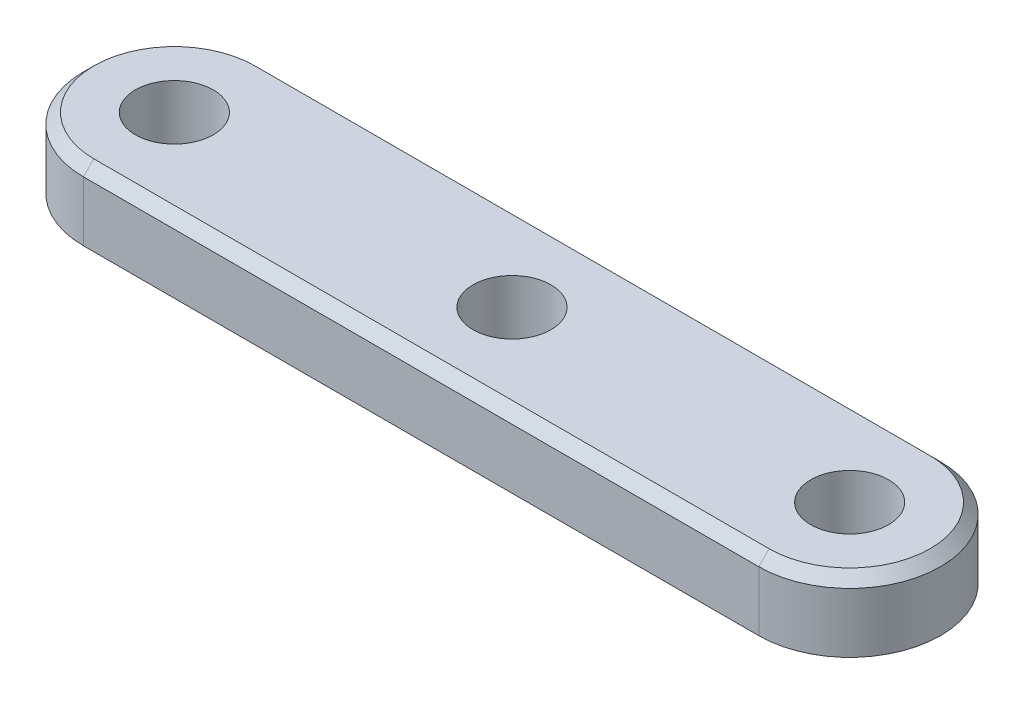
ISO-10303-21;
HEADER;
FILE_DESCRIPTION(('STEP AP214'),'2;1');
FILE_NAME('part.step','',(''),(''),'','','');
FILE_SCHEMA(('AUTOMOTIVE_DESIGN { 1 0 10303 214 1 1 1 1 }'));
ENDSEC;
DATA;
#1=APPLICATION_CONTEXT('core data for automotive mechanical design processes');
#2=APPLICATION_PROTOCOL_DEFINITION('international standard','automotive_design',2000,#1);
#3=PRODUCT_CONTEXT('',#1,'mechanical');
#4=PRODUCT('Part','Part','',(#3));
#5=PRODUCT_RELATED_PRODUCT_CATEGORY('part','',(#4));
#6=PRODUCT_DEFINITION_FORMATION('','',#4);
#7=PRODUCT_DEFINITION_CONTEXT('part definition',#1,'design');
#8=PRODUCT_DEFINITION('design','',#6,#7);
#9=PRODUCT_DEFINITION_SHAPE('','',#8);
#10=(LENGTH_UNIT() NAMED_UNIT(*) SI_UNIT(.MILLI.,.METRE.));
#11=(NAMED_UNIT(*) PLANE_ANGLE_UNIT() SI_UNIT($,.RADIAN.));
#12=(NAMED_UNIT(*) SI_UNIT($,.STERADIAN.) SOLID_ANGLE_UNIT());
#13=UNCERTAINTY_MEASURE_WITH_UNIT(LENGTH_MEASURE(1.E-05),#10,'distance_accuracy_value','');
#14=(GEOMETRIC_REPRESENTATION_CONTEXT(3) GLOBAL_UNCERTAINTY_ASSIGNED_CONTEXT((#13)) GLOBAL_UNIT_ASSIGNED_CONTEXT((#10,
#11,#12)) REPRESENTATION_CONTEXT('',''));
#15=CARTESIAN_POINT('',(0.,0.,0.));
#16=DIRECTION('',(0.,0.,1.));
#17=DIRECTION('',(1.,0.,0.));
#18=AXIS2_PLACEMENT_3D('',#15,#16,#17);
#19=CARTESIAN_POINT('',(-13.,1.35,0.));
#20=DIRECTION('',(0.,1.,0.));
#21=DIRECTION('',(0.,0.,1.));
#22=AXIS2_PLACEMENT_3D('',#19,#20,#21);
#23=PLANE('',#22);
#24=DIRECTION('',(1.,0.,0.));
#25=VECTOR('',#24,1.);
#26=CARTESIAN_POINT('',(13.,1.35,3.1));
#27=LINE('',#26,#25);
#28=CARTESIAN_POINT('',(-13.,1.35,3.1));
#29=VERTEX_POINT('',#28);
#30=CARTESIAN_POINT('',(13.,1.35,3.1));
#31=VERTEX_POINT('',#30);
#32=EDGE_CURVE('E105',#29,#31,#27,.T.);
#33=ORIENTED_EDGE('',*,*,#32,.T.);
#34=CARTESIAN_POINT('',(13.,1.35,0.));
#35=DIRECTION('',(0.,1.,0.));
#36=DIRECTION('',(0.,0.,1.));
#37=AXIS2_PLACEMENT_3D('',#34,#35,#36);
#38=CIRCLE('',#37,3.1);
#39=CARTESIAN_POINT('',(13.,1.35,-3.1));
#40=VERTEX_POINT('',#39);
#41=EDGE_CURVE('E150',#31,#40,#38,.T.);
#42=ORIENTED_EDGE('',*,*,#41,.T.);
#43=DIRECTION('',(-1.,0.,0.));
#44=VECTOR('',#43,1.);
#45=CARTESIAN_POINT('',(-13.,1.35,-3.1));
#46=LINE('',#45,#44);
#47=CARTESIAN_POINT('',(-13.,1.35,-3.1));
#48=VERTEX_POINT('',#47);
#49=EDGE_CURVE('E147',#40,#48,#46,.T.);
#50=ORIENTED_EDGE('',*,*,#49,.T.);
#51=CARTESIAN_POINT('',(-13.,1.35,0.));
#52=DIRECTION('',(0.,1.,0.));
#53=DIRECTION('',(0.,0.,1.));
#54=AXIS2_PLACEMENT_3D('',#51,#52,#53);
#55=CIRCLE('',#54,3.1);
#56=EDGE_CURVE('E144',#48,#29,#55,.T.);
#57=ORIENTED_EDGE('',*,*,#56,.T.);
#58=EDGE_LOOP('',(#33,#42,#50,#57));
#59=FACE_BOUND('',#58,.T.);
#60=CARTESIAN_POINT('',(13.,1.35,0.));
#61=DIRECTION('',(0.,1.,0.));
#62=DIRECTION('',(0.,0.,-1.));
#63=AXIS2_PLACEMENT_3D('',#60,#61,#62);
#64=CIRCLE('',#63,1.5);
#65=CARTESIAN_POINT('',(13.,1.35,-1.50000000000001));
#66=VERTEX_POINT('',#65);
#67=EDGE_CURVE('E192',#66,#66,#64,.T.);
#68=ORIENTED_EDGE('',*,*,#67,.F.);
#69=EDGE_LOOP('',(#68));
#70=FACE_BOUND('',#69,.T.);
#71=CARTESIAN_POINT('',(-13.,1.35,0.));
#72=DIRECTION('',(0.,1.,0.));
#73=DIRECTION('',(0.,0.,1.));
#74=AXIS2_PLACEMENT_3D('',#71,#72,#73);
#75=CIRCLE('',#74,1.5);
#76=CARTESIAN_POINT('',(-13.,1.35,-1.5));
#77=VERTEX_POINT('',#76);
#78=EDGE_CURVE('E122',#77,#77,#75,.T.);
#79=ORIENTED_EDGE('',*,*,#78,.F.);
#80=EDGE_LOOP('',(#79));
#81=FACE_BOUND('',#80,.T.);
#82=CARTESIAN_POINT('',(0.,1.35,0.));
#83=DIRECTION('',(0.,1.,0.));
#84=DIRECTION('',(0.,0.,1.));
#85=AXIS2_PLACEMENT_3D('',#82,#83,#84);
#86=CIRCLE('',#85,1.5);
#87=CARTESIAN_POINT('',(0.,1.35,-1.5));
#88=VERTEX_POINT('',#87);
#89=EDGE_CURVE('E183',#88,#88,#86,.T.);
#90=ORIENTED_EDGE('',*,*,#89,.F.);
#91=EDGE_LOOP('',(#90));
#92=FACE_BOUND('',#91,.T.);
#93=ADVANCED_FACE('F45',(#59,#70,#81,#92),#23,.T.);
#94=CARTESIAN_POINT('',(-13.,-1.35,0.));
#95=DIRECTION('',(0.,1.,0.));
#96=DIRECTION('',(0.,0.,1.));
#97=AXIS2_PLACEMENT_3D('',#94,#95,#96);
#98=PLANE('',#97);
#99=CARTESIAN_POINT('',(-13.,-1.35,0.));
#100=DIRECTION('',(0.,1.,0.));
#101=DIRECTION('',(0.,0.,1.));
#102=AXIS2_PLACEMENT_3D('',#99,#100,#101);
#103=CIRCLE('',#102,3.5);
#104=CARTESIAN_POINT('',(-13.,-1.35,-3.5));
#105=VERTEX_POINT('',#104);
#106=CARTESIAN_POINT('',(-13.,-1.35,3.5));
#107=VERTEX_POINT('',#106);
#108=EDGE_CURVE('E113',#105,#107,#103,.T.);
#109=ORIENTED_EDGE('',*,*,#108,.F.);
#110=DIRECTION('',(-1.,0.,0.));
#111=VECTOR('',#110,1.);
#112=CARTESIAN_POINT('',(-13.,-1.35,-3.5));
#113=LINE('',#112,#111);
#114=CARTESIAN_POINT('',(13.,-1.35,-3.5));
#115=VERTEX_POINT('',#114);
#116=EDGE_CURVE('E132',#115,#105,#113,.T.);
#117=ORIENTED_EDGE('',*,*,#116,.F.);
#118=CARTESIAN_POINT('',(13.,-1.35,0.));
#119=DIRECTION('',(0.,1.,0.));
#120=DIRECTION('',(0.,0.,1.));
#121=AXIS2_PLACEMENT_3D('',#118,#119,#120);
#122=CIRCLE('',#121,3.5);
#123=CARTESIAN_POINT('',(13.,-1.35,3.5));
#124=VERTEX_POINT('',#123);
#125=EDGE_CURVE('E115',#124,#115,#122,.T.);
#126=ORIENTED_EDGE('',*,*,#125,.F.);
#127=DIRECTION('',(1.,0.,0.));
#128=VECTOR('',#127,1.);
#129=CARTESIAN_POINT('',(-13.,-1.35,3.5));
#130=LINE('',#129,#128);
#131=EDGE_CURVE('E101',#107,#124,#130,.T.);
#132=ORIENTED_EDGE('',*,*,#131,.F.);
#133=EDGE_LOOP('',(#109,#117,#126,#132));
#134=FACE_BOUND('',#133,.T.);
#135=CARTESIAN_POINT('',(-13.,-1.35,0.));
#136=DIRECTION('',(0.,1.,0.));
#137=DIRECTION('',(0.,0.,1.));
#138=AXIS2_PLACEMENT_3D('',#135,#136,#137);
#139=CIRCLE('',#138,1.5);
#140=CARTESIAN_POINT('',(-13.,-1.35,-1.5));
#141=VERTEX_POINT('',#140);
#142=EDGE_CURVE('E126',#141,#141,#139,.T.);
#143=ORIENTED_EDGE('',*,*,#142,.T.);
#144=EDGE_LOOP('',(#143));
#145=FACE_BOUND('',#144,.T.);
#146=CARTESIAN_POINT('',(13.,-1.35,0.));
#147=DIRECTION('',(0.,1.,0.));
#148=DIRECTION('',(0.,0.,-1.));
#149=AXIS2_PLACEMENT_3D('',#146,#147,#148);
#150=CIRCLE('',#149,1.5);
#151=CARTESIAN_POINT('',(13.,-1.35,-1.50000000000001));
#152=VERTEX_POINT('',#151);
#153=EDGE_CURVE('E189',#152,#152,#150,.T.);
#154=ORIENTED_EDGE('',*,*,#153,.T.);
#155=EDGE_LOOP('',(#154));
#156=FACE_BOUND('',#155,.T.);
#157=CARTESIAN_POINT('',(0.,-1.35,0.));
#158=DIRECTION('',(0.,1.,0.));
#159=DIRECTION('',(0.,0.,1.));
#160=AXIS2_PLACEMENT_3D('',#157,#158,#159);
#161=CIRCLE('',#160,1.5);
#162=CARTESIAN_POINT('',(0.,-1.35,-1.5));
#163=VERTEX_POINT('',#162);
#164=EDGE_CURVE('E177',#163,#163,#161,.T.);
#165=ORIENTED_EDGE('',*,*,#164,.T.);
#166=EDGE_LOOP('',(#165));
#167=FACE_BOUND('',#166,.T.);
#168=ADVANCED_FACE('F110',(#134,#145,#156,#167),#98,.F.);
#169=CARTESIAN_POINT('',(-13.,1.35,0.));
#170=DIRECTION('',(0.,-1.,0.));
#171=DIRECTION('',(0.,0.,-1.));
#172=AXIS2_PLACEMENT_3D('',#169,#170,#171);
#173=CYLINDRICAL_SURFACE('',#172,3.5);
#174=DIRECTION('',(0.,-1.,0.));
#175=VECTOR('',#174,1.);
#176=CARTESIAN_POINT('',(-13.,1.35,3.5));
#177=LINE('',#176,#175);
#178=CARTESIAN_POINT('',(-13.,0.949999999999999,3.5));
#179=VERTEX_POINT('',#178);
#180=EDGE_CURVE('E98',#179,#107,#177,.T.);
#181=ORIENTED_EDGE('',*,*,#180,.F.);
#182=CARTESIAN_POINT('',(-13.,0.949999999999999,0.));
#183=DIRECTION('',(0.,1.,0.));
#184=DIRECTION('',(0.,0.,1.));
#185=AXIS2_PLACEMENT_3D('',#182,#183,#184);
#186=CIRCLE('',#185,3.5);
#187=CARTESIAN_POINT('',(-13.,0.949999999999999,-3.5));
#188=VERTEX_POINT('',#187);
#189=EDGE_CURVE('E56',#179,#188,#186,.F.);
#190=ORIENTED_EDGE('',*,*,#189,.T.);
#191=DIRECTION('',(0.,-1.,0.));
#192=VECTOR('',#191,1.);
#193=CARTESIAN_POINT('',(-13.,1.35,-3.5));
#194=LINE('',#193,#192);
#195=EDGE_CURVE('E119',#188,#105,#194,.T.);
#196=ORIENTED_EDGE('',*,*,#195,.T.);
#197=ORIENTED_EDGE('',*,*,#108,.T.);
#198=EDGE_LOOP('',(#181,#190,#196,#197));
#199=FACE_BOUND('',#198,.T.);
#200=ADVANCED_FACE('F118',(#199),#173,.T.);
#201=CARTESIAN_POINT('',(-13.,1.35,3.5));
#202=DIRECTION('',(0.,0.,-1.));
#203=DIRECTION('',(-1.,0.,0.));
#204=AXIS2_PLACEMENT_3D('',#201,#202,#203);
#205=PLANE('',#204);
#206=DIRECTION('',(0.,-1.,0.));
#207=VECTOR('',#206,1.);
#208=CARTESIAN_POINT('',(13.,1.35,3.5));
#209=LINE('',#208,#207);
#210=CARTESIAN_POINT('',(13.,0.949999999999999,3.5));
#211=VERTEX_POINT('',#210);
#212=EDGE_CURVE('E106',#211,#124,#209,.T.);
#213=ORIENTED_EDGE('',*,*,#212,.F.);
#214=DIRECTION('',(-1.,0.,0.));
#215=VECTOR('',#214,1.);
#216=CARTESIAN_POINT('',(-13.,0.949999999999999,3.5));
#217=LINE('',#216,#215);
#218=EDGE_CURVE('E11',#211,#179,#217,.T.);
#219=ORIENTED_EDGE('',*,*,#218,.T.);
#220=ORIENTED_EDGE('',*,*,#180,.T.);
#221=ORIENTED_EDGE('',*,*,#131,.T.);
#222=EDGE_LOOP('',(#213,#219,#220,#221));
#223=FACE_BOUND('',#222,.T.);
#224=ADVANCED_FACE('F100',(#223),#205,.F.);
#225=CARTESIAN_POINT('',(13.,1.35,0.));
#226=DIRECTION('',(0.,-1.,0.));
#227=DIRECTION('',(0.,0.,-1.));
#228=AXIS2_PLACEMENT_3D('',#225,#226,#227);
#229=CYLINDRICAL_SURFACE('',#228,3.5);
#230=DIRECTION('',(0.,-1.,0.));
#231=VECTOR('',#230,1.);
#232=CARTESIAN_POINT('',(13.,1.35,-3.5));
#233=LINE('',#232,#231);
#234=CARTESIAN_POINT('',(13.,0.949999999999999,-3.5));
#235=VERTEX_POINT('',#234);
#236=EDGE_CURVE('E137',#235,#115,#233,.T.);
#237=ORIENTED_EDGE('',*,*,#236,.F.);
#238=CARTESIAN_POINT('',(13.,0.949999999999999,0.));
#239=DIRECTION('',(0.,1.,0.));
#240=DIRECTION('',(0.,0.,1.));
#241=AXIS2_PLACEMENT_3D('',#238,#239,#240);
#242=CIRCLE('',#241,3.5);
#243=EDGE_CURVE('E154',#235,#211,#242,.F.);
#244=ORIENTED_EDGE('',*,*,#243,.T.);
#245=ORIENTED_EDGE('',*,*,#212,.T.);
#246=ORIENTED_EDGE('',*,*,#125,.T.);
#247=EDGE_LOOP('',(#237,#244,#245,#246));
#248=FACE_BOUND('',#247,.T.);
#249=ADVANCED_FACE('F227',(#248),#229,.T.);
#250=CARTESIAN_POINT('',(-13.,1.35,-3.5));
#251=DIRECTION('',(0.,0.,1.));
#252=DIRECTION('',(1.,0.,0.));
#253=AXIS2_PLACEMENT_3D('',#250,#251,#252);
#254=PLANE('',#253);
#255=ORIENTED_EDGE('',*,*,#195,.F.);
#256=DIRECTION('',(1.,0.,0.));
#257=VECTOR('',#256,1.);
#258=CARTESIAN_POINT('',(13.,0.949999999999999,-3.5));
#259=LINE('',#258,#257);
#260=EDGE_CURVE('E158',#188,#235,#259,.T.);
#261=ORIENTED_EDGE('',*,*,#260,.T.);
#262=ORIENTED_EDGE('',*,*,#236,.T.);
#263=ORIENTED_EDGE('',*,*,#116,.T.);
#264=EDGE_LOOP('',(#255,#261,#262,#263));
#265=FACE_BOUND('',#264,.T.);
#266=ADVANCED_FACE('F213',(#265),#254,.F.);
#267=CARTESIAN_POINT('',(-13.,1.35,0.));
#268=DIRECTION('',(0.,-1.,0.));
#269=DIRECTION('',(0.,0.,-1.));
#270=AXIS2_PLACEMENT_3D('',#267,#268,#269);
#271=CYLINDRICAL_SURFACE('',#270,1.5);
#272=CARTESIAN_POINT('',(-13.,1.35,-1.5));
#273=CARTESIAN_POINT('',(-13.,1.321875,-1.5));
#274=CARTESIAN_POINT('',(-13.,1.29375,-1.5));
#275=CARTESIAN_POINT('',(-13.,1.2375,-1.5));
#276=CARTESIAN_POINT('',(-13.,1.209375,-1.5));
#277=CARTESIAN_POINT('',(-13.,1.153125,-1.5));
#278=CARTESIAN_POINT('',(-13.,1.125,-1.5));
#279=CARTESIAN_POINT('',(-13.,1.06875,-1.5));
#280=CARTESIAN_POINT('',(-13.,1.040625,-1.5));
#281=CARTESIAN_POINT('',(-13.,0.984375,-1.5));
#282=CARTESIAN_POINT('',(-13.,0.95625,-1.5));
#283=CARTESIAN_POINT('',(-13.,0.9,-1.5));
#284=CARTESIAN_POINT('',(-13.,0.871875,-1.5));
#285=CARTESIAN_POINT('',(-13.,0.815625,-1.5));
#286=CARTESIAN_POINT('',(-13.,0.7875,-1.5));
#287=CARTESIAN_POINT('',(-13.,0.73125,-1.5));
#288=CARTESIAN_POINT('',(-13.,0.703125,-1.5));
#289=CARTESIAN_POINT('',(-13.,0.646875,-1.5));
#290=CARTESIAN_POINT('',(-13.,0.61875,-1.5));
#291=CARTESIAN_POINT('',(-13.,0.5625,-1.5));
#292=CARTESIAN_POINT('',(-13.,0.534375,-1.5));
#293=CARTESIAN_POINT('',(-13.,0.478125,-1.5));
#294=CARTESIAN_POINT('',(-13.,0.45,-1.5));
#295=CARTESIAN_POINT('',(-13.,0.39375,-1.5));
#296=CARTESIAN_POINT('',(-13.,0.365625,-1.5));
#297=CARTESIAN_POINT('',(-13.,0.309375,-1.5));
#298=CARTESIAN_POINT('',(-13.,0.28125,-1.5));
#299=CARTESIAN_POINT('',(-13.,0.225,-1.5));
#300=CARTESIAN_POINT('',(-13.,0.196875,-1.5));
#301=CARTESIAN_POINT('',(-13.,0.140625,-1.5));
#302=CARTESIAN_POINT('',(-13.,0.1125,-1.5));
#303=CARTESIAN_POINT('',(-13.,0.0562499999999996,-1.5));
#304=CARTESIAN_POINT('',(-13.,0.0281249999999996,-1.5));
#305=CARTESIAN_POINT('',(-13.,-0.0281250000000004,-1.5));
#306=CARTESIAN_POINT('',(-13.,-0.0562500000000005,-1.5));
#307=CARTESIAN_POINT('',(-13.,-0.1125,-1.5));
#308=CARTESIAN_POINT('',(-13.,-0.140625,-1.5));
#309=CARTESIAN_POINT('',(-13.,-0.196875000000001,-1.5));
#310=CARTESIAN_POINT('',(-13.,-0.225000000000001,-1.5));
#311=CARTESIAN_POINT('',(-13.,-0.28125,-1.5));
#312=CARTESIAN_POINT('',(-13.,-0.309375000000001,-1.5));
#313=CARTESIAN_POINT('',(-13.,-0.365625000000001,-1.5));
#314=CARTESIAN_POINT('',(-13.,-0.393750000000001,-1.5));
#315=CARTESIAN_POINT('',(-13.,-0.450000000000001,-1.5));
#316=CARTESIAN_POINT('',(-13.,-0.478125000000001,-1.5));
#317=CARTESIAN_POINT('',(-13.,-0.534375000000001,-1.5));
#318=CARTESIAN_POINT('',(-13.,-0.562500000000001,-1.5));
#319=CARTESIAN_POINT('',(-13.,-0.61875,-1.5));
#320=CARTESIAN_POINT('',(-13.,-0.646875,-1.5));
#321=CARTESIAN_POINT('',(-13.,-0.703125,-1.5));
#322=CARTESIAN_POINT('',(-13.,-0.73125,-1.5));
#323=CARTESIAN_POINT('',(-13.,-0.7875,-1.5));
#324=CARTESIAN_POINT('',(-13.,-0.815625,-1.5));
#325=CARTESIAN_POINT('',(-13.,-0.871875,-1.5));
#326=CARTESIAN_POINT('',(-13.,-0.9,-1.5));
#327=CARTESIAN_POINT('',(-13.,-0.95625,-1.5));
#328=CARTESIAN_POINT('',(-13.,-0.984375,-1.5));
#329=CARTESIAN_POINT('',(-13.,-1.040625,-1.5));
#330=CARTESIAN_POINT('',(-13.,-1.06875,-1.5));
#331=CARTESIAN_POINT('',(-13.,-1.125,-1.5));
#332=CARTESIAN_POINT('',(-13.,-1.153125,-1.5));
#333=CARTESIAN_POINT('',(-13.,-1.209375,-1.5));
#334=CARTESIAN_POINT('',(-13.,-1.2375,-1.5));
#335=CARTESIAN_POINT('',(-13.,-1.29375,-1.5));
#336=CARTESIAN_POINT('',(-13.,-1.321875,-1.5));
#337=CARTESIAN_POINT('',(-13.,-1.35,-1.5));
#338=B_SPLINE_CURVE_WITH_KNOTS('',3,(#272,#273,#274,#275,#276,#277,#278,#279,#280,#281,#282,
#283,#284,#285,#286,#287,#288,#289,#290,#291,#292,#293,#294,#295,#296,#297,#298,#299,#300,#301,
#302,#303,#304,#305,#306,#307,#308,#309,#310,#311,#312,#313,#314,#315,#316,#317,#318,#319,#320,
#321,#322,#323,#324,#325,#326,#327,#328,#329,#330,#331,#332,#333,#334,#335,#336,#337),
.UNSPECIFIED.,.F.,.F.,(4,2,2,2,2,2,2,2,2,2,2,2,2,2,2,2,2,2,2,2,2,2,2,2,2,2,2,2,2,2,2,2,4),(0.,
0.0843749999999998,0.16875,0.253125,0.3375,0.421875,0.50625,0.590625,0.675,0.759375,0.84375,
0.928125,1.0125,1.096875,1.18125,1.265625,1.35,1.434375,1.51875,1.603125,1.6875,1.771875,
1.85625,1.940625,2.025,2.109375,2.19375,2.278125,2.3625,2.446875,2.53125,2.615625,2.7),.UNSPECIFIED.);
#339=EDGE_CURVE('BSEAM204',#77,#141,#338,.T.);
#340=ORIENTED_EDGE('',*,*,#78,.T.);
#341=ORIENTED_EDGE('',*,*,#142,.F.);
#342=ORIENTED_EDGE('',*,*,#339,.T.);
#343=ORIENTED_EDGE('',*,*,#339,.F.);
#344=EDGE_LOOP('',(#340,#342,#341,#343));
#345=FACE_BOUND('',#344,.T.);
#346=ADVANCED_FACE('F204',(#345),#271,.F.);
#347=CARTESIAN_POINT('',(13.,1.35,0.));
#348=DIRECTION('',(0.,-1.,0.));
#349=DIRECTION('',(0.,0.,-1.));
#350=AXIS2_PLACEMENT_3D('',#347,#348,#349);
#351=CYLINDRICAL_SURFACE('',#350,1.5);
#352=CARTESIAN_POINT('',(13.,1.35,-1.50000000000001));
#353=CARTESIAN_POINT('',(13.,1.321875,-1.50000000000001));
#354=CARTESIAN_POINT('',(13.,1.29375,-1.50000000000001));
#355=CARTESIAN_POINT('',(13.,1.2375,-1.50000000000001));
#356=CARTESIAN_POINT('',(13.,1.209375,-1.50000000000001));
#357=CARTESIAN_POINT('',(13.,1.153125,-1.50000000000001));
#358=CARTESIAN_POINT('',(13.,1.125,-1.50000000000001));
#359=CARTESIAN_POINT('',(13.,1.06875,-1.50000000000001));
#360=CARTESIAN_POINT('',(13.,1.040625,-1.50000000000001));
#361=CARTESIAN_POINT('',(13.,0.984375,-1.50000000000001));
#362=CARTESIAN_POINT('',(13.,0.95625,-1.50000000000001));
#363=CARTESIAN_POINT('',(13.,0.9,-1.50000000000001));
#364=CARTESIAN_POINT('',(13.,0.871875,-1.50000000000001));
#365=CARTESIAN_POINT('',(13.,0.815625,-1.50000000000001));
#366=CARTESIAN_POINT('',(13.,0.7875,-1.50000000000001));
#367=CARTESIAN_POINT('',(13.,0.73125,-1.50000000000001));
#368=CARTESIAN_POINT('',(13.,0.703125,-1.50000000000001));
#369=CARTESIAN_POINT('',(13.,0.646875,-1.50000000000001));
#370=CARTESIAN_POINT('',(13.,0.61875,-1.50000000000001));
#371=CARTESIAN_POINT('',(13.,0.5625,-1.50000000000001));
#372=CARTESIAN_POINT('',(13.,0.534375,-1.50000000000001));
#373=CARTESIAN_POINT('',(13.,0.478125,-1.50000000000001));
#374=CARTESIAN_POINT('',(13.,0.45,-1.50000000000001));
#375=CARTESIAN_POINT('',(13.,0.39375,-1.50000000000001));
#376=CARTESIAN_POINT('',(13.,0.365625,-1.50000000000001));
#377=CARTESIAN_POINT('',(13.,0.309375,-1.50000000000001));
#378=CARTESIAN_POINT('',(13.,0.28125,-1.50000000000001));
#379=CARTESIAN_POINT('',(13.,0.225,-1.50000000000001));
#380=CARTESIAN_POINT('',(13.,0.196875,-1.50000000000001));
#381=CARTESIAN_POINT('',(13.,0.140625,-1.50000000000001));
#382=CARTESIAN_POINT('',(13.,0.1125,-1.50000000000001));
#383=CARTESIAN_POINT('',(13.,0.0562499999999996,-1.50000000000001));
#384=CARTESIAN_POINT('',(13.,0.0281249999999996,-1.50000000000001));
#385=CARTESIAN_POINT('',(13.,-0.0281250000000004,-1.50000000000001));
#386=CARTESIAN_POINT('',(13.,-0.0562500000000005,-1.50000000000001));
#387=CARTESIAN_POINT('',(13.,-0.1125,-1.50000000000001));
#388=CARTESIAN_POINT('',(13.,-0.140625,-1.50000000000001));
#389=CARTESIAN_POINT('',(13.,-0.196875000000001,-1.50000000000001));
#390=CARTESIAN_POINT('',(13.,-0.225000000000001,-1.50000000000001));
#391=CARTESIAN_POINT('',(13.,-0.28125,-1.50000000000001));
#392=CARTESIAN_POINT('',(13.,-0.309375000000001,-1.50000000000001));
#393=CARTESIAN_POINT('',(13.,-0.365625000000001,-1.50000000000001));
#394=CARTESIAN_POINT('',(13.,-0.393750000000001,-1.50000000000001));
#395=CARTESIAN_POINT('',(13.,-0.450000000000001,-1.50000000000001));
#396=CARTESIAN_POINT('',(13.,-0.478125000000001,-1.50000000000001));
#397=CARTESIAN_POINT('',(13.,-0.534375000000001,-1.50000000000001));
#398=CARTESIAN_POINT('',(13.,-0.562500000000001,-1.50000000000001));
#399=CARTESIAN_POINT('',(13.,-0.61875,-1.50000000000001));
#400=CARTESIAN_POINT('',(13.,-0.646875,-1.50000000000001));
#401=CARTESIAN_POINT('',(13.,-0.703125,-1.50000000000001));
#402=CARTESIAN_POINT('',(13.,-0.73125,-1.50000000000001));
#403=CARTESIAN_POINT('',(13.,-0.7875,-1.50000000000001));
#404=CARTESIAN_POINT('',(13.,-0.815625,-1.50000000000001));
#405=CARTESIAN_POINT('',(13.,-0.871875,-1.50000000000001));
#406=CARTESIAN_POINT('',(13.,-0.9,-1.50000000000001));
#407=CARTESIAN_POINT('',(13.,-0.95625,-1.50000000000001));
#408=CARTESIAN_POINT('',(13.,-0.984375,-1.50000000000001));
#409=CARTESIAN_POINT('',(13.,-1.040625,-1.50000000000001));
#410=CARTESIAN_POINT('',(13.,-1.06875,-1.50000000000001));
#411=CARTESIAN_POINT('',(13.,-1.125,-1.50000000000001));
#412=CARTESIAN_POINT('',(13.,-1.153125,-1.50000000000001));
#413=CARTESIAN_POINT('',(13.,-1.209375,-1.50000000000001));
#414=CARTESIAN_POINT('',(13.,-1.2375,-1.50000000000001));
#415=CARTESIAN_POINT('',(13.,-1.29375,-1.50000000000001));
#416=CARTESIAN_POINT('',(13.,-1.321875,-1.50000000000001));
#417=CARTESIAN_POINT('',(13.,-1.35,-1.50000000000001));
#418=B_SPLINE_CURVE_WITH_KNOTS('',3,(#352,#353,#354,#355,#356,#357,#358,#359,#360,#361,#362,
#363,#364,#365,#366,#367,#368,#369,#370,#371,#372,#373,#374,#375,#376,#377,#378,#379,#380,#381,
#382,#383,#384,#385,#386,#387,#388,#389,#390,#391,#392,#393,#394,#395,#396,#397,#398,#399,#400,
#401,#402,#403,#404,#405,#406,#407,#408,#409,#410,#411,#412,#413,#414,#415,#416,#417),
.UNSPECIFIED.,.F.,.F.,(4,2,2,2,2,2,2,2,2,2,2,2,2,2,2,2,2,2,2,2,2,2,2,2,2,2,2,2,2,2,2,2,4),(0.,
0.0843749999999998,0.16875,0.253125,0.3375,0.421875,0.50625,0.590625,0.675,0.759375,0.84375,
0.928125,1.0125,1.096875,1.18125,1.265625,1.35,1.434375,1.51875,1.603125,1.6875,1.771875,
1.85625,1.940625,2.025,2.109375,2.19375,2.278125,2.3625,2.446875,2.53125,2.615625,2.7),.UNSPECIFIED.);
#419=EDGE_CURVE('BSEAM201',#66,#152,#418,.T.);
#420=ORIENTED_EDGE('',*,*,#67,.T.);
#421=ORIENTED_EDGE('',*,*,#153,.F.);
#422=ORIENTED_EDGE('',*,*,#419,.T.);
#423=ORIENTED_EDGE('',*,*,#419,.F.);
#424=EDGE_LOOP('',(#420,#422,#421,#423));
#425=FACE_BOUND('',#424,.T.);
#426=ADVANCED_FACE('F201',(#425),#351,.F.);
#427=CARTESIAN_POINT('',(0.,1.35,0.));
#428=DIRECTION('',(0.,-1.,0.));
#429=DIRECTION('',(0.,0.,-1.));
#430=AXIS2_PLACEMENT_3D('',#427,#428,#429);
#431=CYLINDRICAL_SURFACE('',#430,1.5);
#432=CARTESIAN_POINT('',(0.,1.35,-1.5));
#433=CARTESIAN_POINT('',(0.,1.321875,-1.5));
#434=CARTESIAN_POINT('',(0.,1.29375,-1.5));
#435=CARTESIAN_POINT('',(0.,1.2375,-1.5));
#436=CARTESIAN_POINT('',(0.,1.209375,-1.5));
#437=CARTESIAN_POINT('',(0.,1.153125,-1.5));
#438=CARTESIAN_POINT('',(0.,1.125,-1.5));
#439=CARTESIAN_POINT('',(0.,1.06875,-1.5));
#440=CARTESIAN_POINT('',(0.,1.040625,-1.5));
#441=CARTESIAN_POINT('',(0.,0.984375,-1.5));
#442=CARTESIAN_POINT('',(0.,0.95625,-1.5));
#443=CARTESIAN_POINT('',(0.,0.9,-1.5));
#444=CARTESIAN_POINT('',(0.,0.871875,-1.5));
#445=CARTESIAN_POINT('',(0.,0.815625,-1.5));
#446=CARTESIAN_POINT('',(0.,0.7875,-1.5));
#447=CARTESIAN_POINT('',(0.,0.73125,-1.5));
#448=CARTESIAN_POINT('',(0.,0.703125,-1.5));
#449=CARTESIAN_POINT('',(0.,0.646875,-1.5));
#450=CARTESIAN_POINT('',(0.,0.61875,-1.5));
#451=CARTESIAN_POINT('',(0.,0.5625,-1.5));
#452=CARTESIAN_POINT('',(0.,0.534375,-1.5));
#453=CARTESIAN_POINT('',(0.,0.478125,-1.5));
#454=CARTESIAN_POINT('',(0.,0.45,-1.5));
#455=CARTESIAN_POINT('',(0.,0.39375,-1.5));
#456=CARTESIAN_POINT('',(0.,0.365625,-1.5));
#457=CARTESIAN_POINT('',(0.,0.309375,-1.5));
#458=CARTESIAN_POINT('',(0.,0.28125,-1.5));
#459=CARTESIAN_POINT('',(0.,0.225,-1.5));
#460=CARTESIAN_POINT('',(0.,0.196875,-1.5));
#461=CARTESIAN_POINT('',(0.,0.140625,-1.5));
#462=CARTESIAN_POINT('',(0.,0.1125,-1.5));
#463=CARTESIAN_POINT('',(0.,0.0562499999999996,-1.5));
#464=CARTESIAN_POINT('',(0.,0.0281249999999996,-1.5));
#465=CARTESIAN_POINT('',(0.,-0.0281250000000004,-1.5));
#466=CARTESIAN_POINT('',(0.,-0.0562500000000005,-1.5));
#467=CARTESIAN_POINT('',(0.,-0.1125,-1.5));
#468=CARTESIAN_POINT('',(0.,-0.140625,-1.5));
#469=CARTESIAN_POINT('',(0.,-0.196875000000001,-1.5));
#470=CARTESIAN_POINT('',(0.,-0.225000000000001,-1.5));
#471=CARTESIAN_POINT('',(0.,-0.28125,-1.5));
#472=CARTESIAN_POINT('',(0.,-0.309375000000001,-1.5));
#473=CARTESIAN_POINT('',(0.,-0.365625000000001,-1.5));
#474=CARTESIAN_POINT('',(0.,-0.393750000000001,-1.5));
#475=CARTESIAN_POINT('',(0.,-0.450000000000001,-1.5));
#476=CARTESIAN_POINT('',(0.,-0.478125000000001,-1.5));
#477=CARTESIAN_POINT('',(0.,-0.534375000000001,-1.5));
#478=CARTESIAN_POINT('',(0.,-0.562500000000001,-1.5));
#479=CARTESIAN_POINT('',(0.,-0.61875,-1.5));
#480=CARTESIAN_POINT('',(0.,-0.646875,-1.5));
#481=CARTESIAN_POINT('',(0.,-0.703125,-1.5));
#482=CARTESIAN_POINT('',(0.,-0.73125,-1.5));
#483=CARTESIAN_POINT('',(0.,-0.7875,-1.5));
#484=CARTESIAN_POINT('',(0.,-0.815625,-1.5));
#485=CARTESIAN_POINT('',(0.,-0.871875,-1.5));
#486=CARTESIAN_POINT('',(0.,-0.9,-1.5));
#487=CARTESIAN_POINT('',(0.,-0.95625,-1.5));
#488=CARTESIAN_POINT('',(0.,-0.984375,-1.5));
#489=CARTESIAN_POINT('',(0.,-1.040625,-1.5));
#490=CARTESIAN_POINT('',(0.,-1.06875,-1.5));
#491=CARTESIAN_POINT('',(0.,-1.125,-1.5));
#492=CARTESIAN_POINT('',(0.,-1.153125,-1.5));
#493=CARTESIAN_POINT('',(0.,-1.209375,-1.5));
#494=CARTESIAN_POINT('',(0.,-1.2375,-1.5));
#495=CARTESIAN_POINT('',(0.,-1.29375,-1.5));
#496=CARTESIAN_POINT('',(0.,-1.321875,-1.5));
#497=CARTESIAN_POINT('',(0.,-1.35,-1.5));
#498=B_SPLINE_CURVE_WITH_KNOTS('',3,(#432,#433,#434,#435,#436,#437,#438,#439,#440,#441,#442,
#443,#444,#445,#446,#447,#448,#449,#450,#451,#452,#453,#454,#455,#456,#457,#458,#459,#460,#461,
#462,#463,#464,#465,#466,#467,#468,#469,#470,#471,#472,#473,#474,#475,#476,#477,#478,#479,#480,
#481,#482,#483,#484,#485,#486,#487,#488,#489,#490,#491,#492,#493,#494,#495,#496,#497),
.UNSPECIFIED.,.F.,.F.,(4,2,2,2,2,2,2,2,2,2,2,2,2,2,2,2,2,2,2,2,2,2,2,2,2,2,2,2,2,2,2,2,4),(0.,
0.0843749999999998,0.16875,0.253125,0.3375,0.421875,0.50625,0.590625,0.675,0.759375,0.84375,
0.928125,1.0125,1.096875,1.18125,1.265625,1.35,1.434375,1.51875,1.603125,1.6875,1.771875,
1.85625,1.940625,2.025,2.109375,2.19375,2.278125,2.3625,2.446875,2.53125,2.615625,2.7),.UNSPECIFIED.);
#499=EDGE_CURVE('BSEAM203',#88,#163,#498,.T.);
#500=ORIENTED_EDGE('',*,*,#89,.T.);
#501=ORIENTED_EDGE('',*,*,#164,.F.);
#502=ORIENTED_EDGE('',*,*,#499,.T.);
#503=ORIENTED_EDGE('',*,*,#499,.F.);
#504=EDGE_LOOP('',(#500,#502,#501,#503));
#505=FACE_BOUND('',#504,.T.);
#506=ADVANCED_FACE('F203',(#505),#431,.F.);
#507=CARTESIAN_POINT('',(-13.,1.35,0.));
#508=DIRECTION('',(0.,-1.,0.));
#509=DIRECTION('',(0.,0.,-1.));
#510=AXIS2_PLACEMENT_3D('',#507,#508,#509);
#511=CONICAL_SURFACE('',#510,3.1,0.785398163397448);
#512=DIRECTION('',(0.,0.707106781186547,0.707106781186547));
#513=VECTOR('',#512,1.);
#514=CARTESIAN_POINT('',(-13.,0.949999999999999,-3.5));
#515=LINE('',#514,#513);
#516=EDGE_CURVE('E168',#188,#48,#515,.T.);
#517=ORIENTED_EDGE('',*,*,#516,.F.);
#518=ORIENTED_EDGE('',*,*,#189,.F.);
#519=DIRECTION('',(0.,-0.707106781186547,0.707106781186547));
#520=VECTOR('',#519,1.);
#521=CARTESIAN_POINT('',(-13.,1.35,3.1));
#522=LINE('',#521,#520);
#523=EDGE_CURVE('E50',#29,#179,#522,.T.);
#524=ORIENTED_EDGE('',*,*,#523,.F.);
#525=ORIENTED_EDGE('',*,*,#56,.F.);
#526=EDGE_LOOP('',(#517,#518,#524,#525));
#527=FACE_BOUND('',#526,.T.);
#528=ADVANCED_FACE('F48',(#527),#511,.T.);
#529=CARTESIAN_POINT('',(-13.,1.35,3.1));
#530=DIRECTION('',(0.,0.707106781186547,0.707106781186547));
#531=DIRECTION('',(-1.,0.,0.));
#532=AXIS2_PLACEMENT_3D('',#529,#530,#531);
#533=PLANE('',#532);
#534=ORIENTED_EDGE('',*,*,#523,.T.);
#535=ORIENTED_EDGE('',*,*,#218,.F.);
#536=DIRECTION('',(0.,-0.707106781186547,0.707106781186547));
#537=VECTOR('',#536,1.);
#538=CARTESIAN_POINT('',(13.,1.35,3.1));
#539=LINE('',#538,#537);
#540=EDGE_CURVE('E166',#31,#211,#539,.T.);
#541=ORIENTED_EDGE('',*,*,#540,.F.);
#542=ORIENTED_EDGE('',*,*,#32,.F.);
#543=EDGE_LOOP('',(#534,#535,#541,#542));
#544=FACE_BOUND('',#543,.T.);
#545=ADVANCED_FACE('F249',(#544),#533,.T.);
#546=CARTESIAN_POINT('',(-13.,1.35,-3.1));
#547=DIRECTION('',(0.,0.707106781186547,-0.707106781186547));
#548=DIRECTION('',(1.,0.,0.));
#549=AXIS2_PLACEMENT_3D('',#546,#547,#548);
#550=PLANE('',#549);
#551=ORIENTED_EDGE('',*,*,#516,.T.);
#552=ORIENTED_EDGE('',*,*,#49,.F.);
#553=DIRECTION('',(0.,0.707106781186547,0.707106781186547));
#554=VECTOR('',#553,1.);
#555=CARTESIAN_POINT('',(13.,0.949999999999999,-3.5));
#556=LINE('',#555,#554);
#557=EDGE_CURVE('E163',#235,#40,#556,.T.);
#558=ORIENTED_EDGE('',*,*,#557,.F.);
#559=ORIENTED_EDGE('',*,*,#260,.F.);
#560=EDGE_LOOP('',(#551,#552,#558,#559));
#561=FACE_BOUND('',#560,.T.);
#562=ADVANCED_FACE('F243',(#561),#550,.T.);
#563=CARTESIAN_POINT('',(13.,1.35,0.));
#564=DIRECTION('',(0.,-1.,0.));
#565=DIRECTION('',(0.,0.,-1.));
#566=AXIS2_PLACEMENT_3D('',#563,#564,#565);
#567=CONICAL_SURFACE('',#566,3.1,0.785398163397448);
#568=ORIENTED_EDGE('',*,*,#540,.T.);
#569=ORIENTED_EDGE('',*,*,#243,.F.);
#570=ORIENTED_EDGE('',*,*,#557,.T.);
#571=ORIENTED_EDGE('',*,*,#41,.F.);
#572=EDGE_LOOP('',(#568,#569,#570,#571));
#573=FACE_BOUND('',#572,.T.);
#574=ADVANCED_FACE('F237',(#573),#567,.T.);
#575=CLOSED_SHELL('',(#93,#168,#200,#224,#249,#266,#346,#426,#506,#528,#545,#562,#574));
#576=MANIFOLD_SOLID_BREP('B2',#575);
#577=ADVANCED_BREP_SHAPE_REPRESENTATION('',(#18,#576),#14);
#578=SHAPE_DEFINITION_REPRESENTATION(#9,#577);
ENDSEC;
END-ISO-10303-21;
